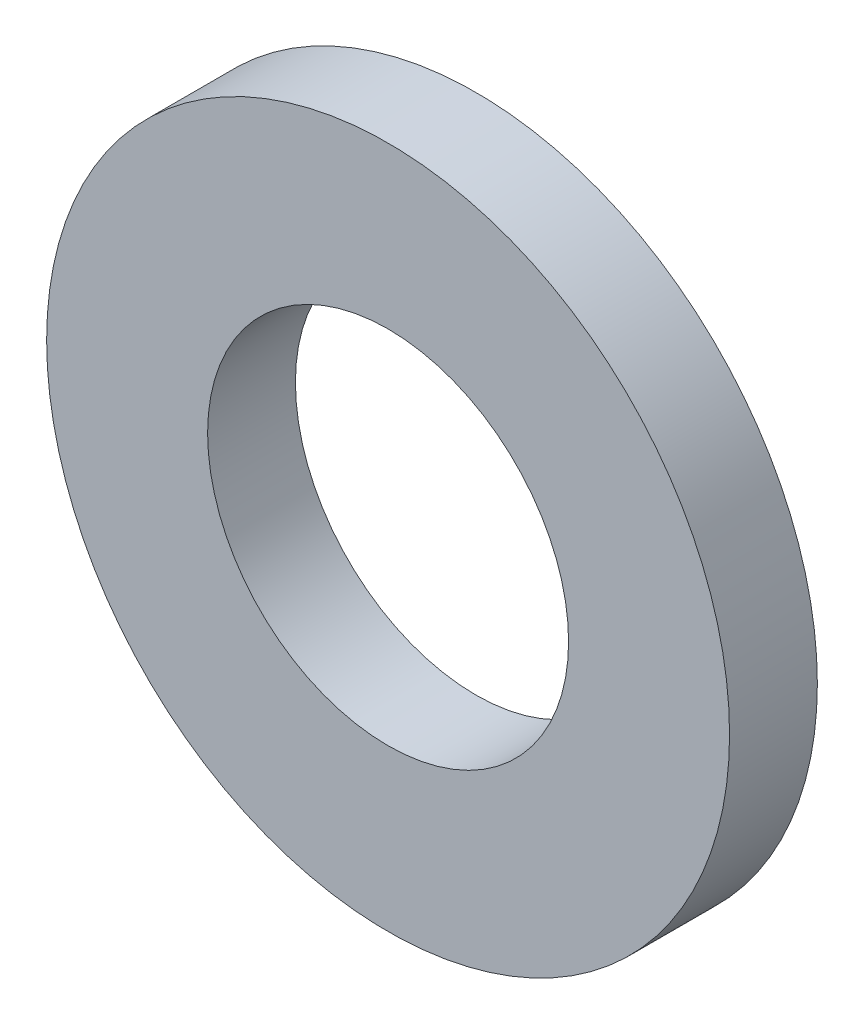
ISO-10303-21;
HEADER;
FILE_DESCRIPTION(('STEP AP214'),'2;1');
FILE_NAME('part.step','',(''),(''),'','','');
FILE_SCHEMA(('AUTOMOTIVE_DESIGN { 1 0 10303 214 1 1 1 1 }'));
ENDSEC;
DATA;
#1=APPLICATION_CONTEXT('core data for automotive mechanical design processes');
#2=APPLICATION_PROTOCOL_DEFINITION('international standard','automotive_design',2000,#1);
#3=PRODUCT_CONTEXT('',#1,'mechanical');
#4=PRODUCT('Part','Part','',(#3));
#5=PRODUCT_RELATED_PRODUCT_CATEGORY('part','',(#4));
#6=PRODUCT_DEFINITION_FORMATION('','',#4);
#7=PRODUCT_DEFINITION_CONTEXT('part definition',#1,'design');
#8=PRODUCT_DEFINITION('design','',#6,#7);
#9=PRODUCT_DEFINITION_SHAPE('','',#8);
#10=(LENGTH_UNIT() NAMED_UNIT(*) SI_UNIT(.MILLI.,.METRE.));
#11=(NAMED_UNIT(*) PLANE_ANGLE_UNIT() SI_UNIT($,.RADIAN.));
#12=(NAMED_UNIT(*) SI_UNIT($,.STERADIAN.) SOLID_ANGLE_UNIT());
#13=UNCERTAINTY_MEASURE_WITH_UNIT(LENGTH_MEASURE(1.E-05),#10,'distance_accuracy_value','');
#14=(GEOMETRIC_REPRESENTATION_CONTEXT(3) GLOBAL_UNCERTAINTY_ASSIGNED_CONTEXT((#13)) GLOBAL_UNIT_ASSIGNED_CONTEXT((#10,
#11,#12)) REPRESENTATION_CONTEXT('',''));
#15=CARTESIAN_POINT('',(0.,0.,0.));
#16=DIRECTION('',(0.,0.,1.));
#17=DIRECTION('',(1.,0.,0.));
#18=AXIS2_PLACEMENT_3D('',#15,#16,#17);
#19=CARTESIAN_POINT('',(0.,0.,1.8));
#20=DIRECTION('',(0.,0.,1.));
#21=DIRECTION('',(1.,0.,0.));
#22=AXIS2_PLACEMENT_3D('',#19,#20,#21);
#23=PLANE('',#22);
#24=CARTESIAN_POINT('',(0.,0.,1.8));
#25=DIRECTION('',(0.,0.,1.));
#26=DIRECTION('',(1.,0.,0.));
#27=AXIS2_PLACEMENT_3D('',#24,#25,#26);
#28=CIRCLE('',#27,7.);
#29=CARTESIAN_POINT('',(7.,0.,1.8));
#30=VERTEX_POINT('',#29);
#31=EDGE_CURVE('E10',#30,#30,#28,.T.);
#32=ORIENTED_EDGE('',*,*,#31,.T.);
#33=EDGE_LOOP('',(#32));
#34=FACE_BOUND('',#33,.T.);
#35=CARTESIAN_POINT('',(0.,0.,1.8));
#36=DIRECTION('',(0.,0.,1.));
#37=DIRECTION('',(1.,0.,0.));
#38=AXIS2_PLACEMENT_3D('',#35,#36,#37);
#39=CIRCLE('',#38,3.7);
#40=CARTESIAN_POINT('',(3.7,0.,1.8));
#41=VERTEX_POINT('',#40);
#42=EDGE_CURVE('E54',#41,#41,#39,.T.);
#43=ORIENTED_EDGE('',*,*,#42,.F.);
#44=EDGE_LOOP('',(#43));
#45=FACE_BOUND('',#44,.T.);
#46=ADVANCED_FACE('F40',(#34,#45),#23,.T.);
#47=CARTESIAN_POINT('',(0.,0.,0.));
#48=DIRECTION('',(0.,0.,1.));
#49=DIRECTION('',(1.,0.,0.));
#50=AXIS2_PLACEMENT_3D('',#47,#48,#49);
#51=PLANE('',#50);
#52=CARTESIAN_POINT('',(0.,0.,0.));
#53=DIRECTION('',(0.,0.,1.));
#54=DIRECTION('',(1.,0.,0.));
#55=AXIS2_PLACEMENT_3D('',#52,#53,#54);
#56=CIRCLE('',#55,7.);
#57=CARTESIAN_POINT('',(7.,0.,0.));
#58=VERTEX_POINT('',#57);
#59=EDGE_CURVE('E44',#58,#58,#56,.T.);
#60=ORIENTED_EDGE('',*,*,#59,.F.);
#61=EDGE_LOOP('',(#60));
#62=FACE_BOUND('',#61,.T.);
#63=CARTESIAN_POINT('',(0.,0.,0.));
#64=DIRECTION('',(0.,0.,1.));
#65=DIRECTION('',(1.,0.,0.));
#66=AXIS2_PLACEMENT_3D('',#63,#64,#65);
#67=CIRCLE('',#66,3.7);
#68=CARTESIAN_POINT('',(3.7,0.,0.));
#69=VERTEX_POINT('',#68);
#70=EDGE_CURVE('E56',#69,#69,#67,.T.);
#71=ORIENTED_EDGE('',*,*,#70,.T.);
#72=EDGE_LOOP('',(#71));
#73=FACE_BOUND('',#72,.T.);
#74=ADVANCED_FACE('F69',(#62,#73),#51,.F.);
#75=CARTESIAN_POINT('',(0.,0.,1.8));
#76=DIRECTION('',(0.,0.,-1.));
#77=DIRECTION('',(-1.,0.,0.));
#78=AXIS2_PLACEMENT_3D('',#75,#76,#77);
#79=CYLINDRICAL_SURFACE('',#78,7.);
#80=ORIENTED_EDGE('',*,*,#31,.F.);
#81=EDGE_LOOP('',(#80));
#82=FACE_BOUND('',#81,.T.);
#83=ORIENTED_EDGE('',*,*,#59,.T.);
#84=EDGE_LOOP('',(#83));
#85=FACE_BOUND('',#84,.T.);
#86=ADVANCED_FACE('F42',(#82,#85),#79,.T.);
#87=CARTESIAN_POINT('',(0.,0.,1.8));
#88=DIRECTION('',(0.,0.,-1.));
#89=DIRECTION('',(-1.,0.,0.));
#90=AXIS2_PLACEMENT_3D('',#87,#88,#89);
#91=CYLINDRICAL_SURFACE('',#90,3.7);
#92=ORIENTED_EDGE('',*,*,#42,.T.);
#93=EDGE_LOOP('',(#92));
#94=FACE_BOUND('',#93,.T.);
#95=ORIENTED_EDGE('',*,*,#70,.F.);
#96=EDGE_LOOP('',(#95));
#97=FACE_BOUND('',#96,.T.);
#98=ADVANCED_FACE('F65',(#94,#97),#91,.F.);
#99=CLOSED_SHELL('',(#46,#74,#86,#98));
#100=MANIFOLD_SOLID_BREP('B2',#99);
#101=ADVANCED_BREP_SHAPE_REPRESENTATION('',(#18,#100),#14);
#102=SHAPE_DEFINITION_REPRESENTATION(#9,#101);
ENDSEC;
END-ISO-10303-21;
